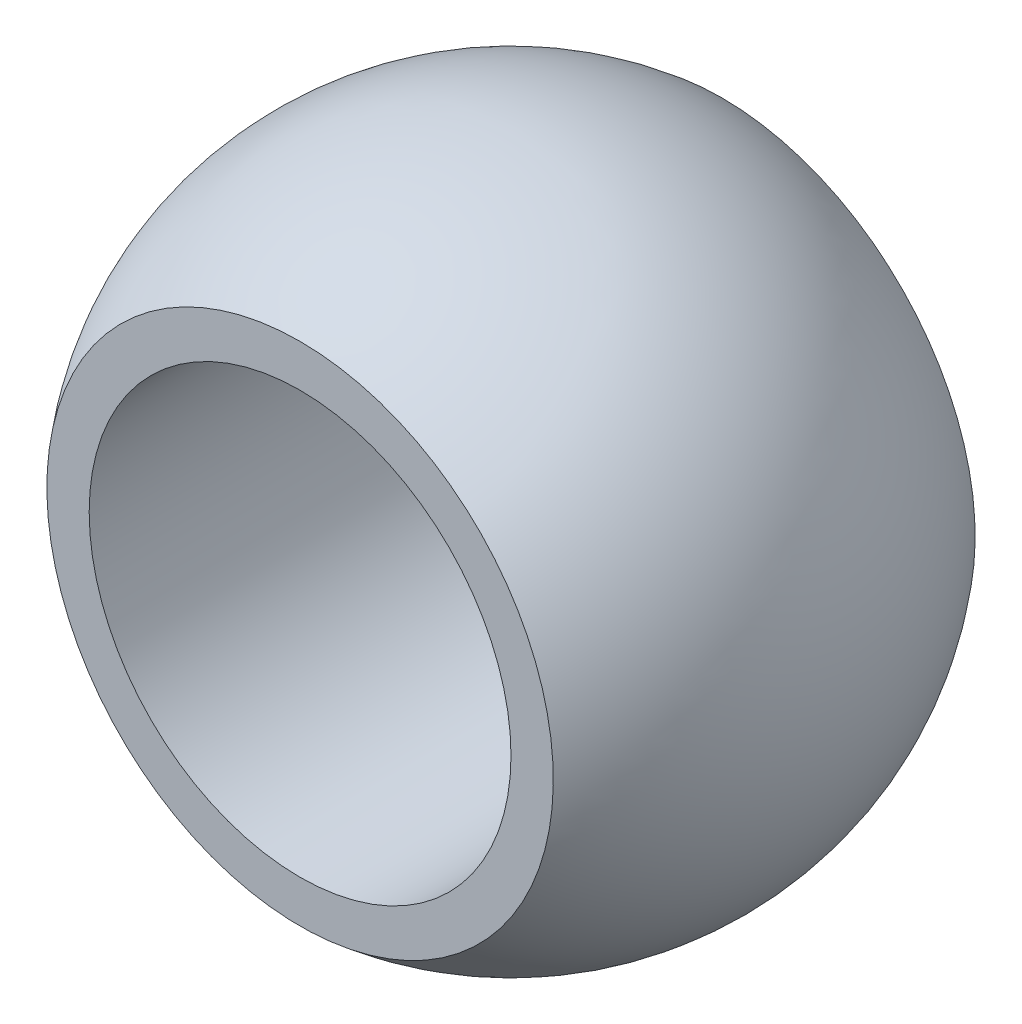
ISO-10303-21;
HEADER;
FILE_DESCRIPTION(('STEP AP214'),'2;1');
FILE_NAME('part.step','',(''),(''),'','','');
FILE_SCHEMA(('AUTOMOTIVE_DESIGN { 1 0 10303 214 1 1 1 1 }'));
ENDSEC;
DATA;
#1=APPLICATION_CONTEXT('core data for automotive mechanical design processes');
#2=APPLICATION_PROTOCOL_DEFINITION('international standard','automotive_design',2000,#1);
#3=PRODUCT_CONTEXT('',#1,'mechanical');
#4=PRODUCT('Part','Part','',(#3));
#5=PRODUCT_RELATED_PRODUCT_CATEGORY('part','',(#4));
#6=PRODUCT_DEFINITION_FORMATION('','',#4);
#7=PRODUCT_DEFINITION_CONTEXT('part definition',#1,'design');
#8=PRODUCT_DEFINITION('design','',#6,#7);
#9=PRODUCT_DEFINITION_SHAPE('','',#8);
#10=(LENGTH_UNIT() NAMED_UNIT(*) SI_UNIT(.MILLI.,.METRE.));
#11=(NAMED_UNIT(*) PLANE_ANGLE_UNIT() SI_UNIT($,.RADIAN.));
#12=(NAMED_UNIT(*) SI_UNIT($,.STERADIAN.) SOLID_ANGLE_UNIT());
#13=UNCERTAINTY_MEASURE_WITH_UNIT(LENGTH_MEASURE(1.E-05),#10,'distance_accuracy_value','');
#14=(GEOMETRIC_REPRESENTATION_CONTEXT(3) GLOBAL_UNCERTAINTY_ASSIGNED_CONTEXT((#13)) GLOBAL_UNIT_ASSIGNED_CONTEXT((#10,
#11,#12)) REPRESENTATION_CONTEXT('',''));
#15=CARTESIAN_POINT('',(0.,0.,0.));
#16=DIRECTION('',(0.,0.,1.));
#17=DIRECTION('',(1.,0.,0.));
#18=AXIS2_PLACEMENT_3D('',#15,#16,#17);
#19=CARTESIAN_POINT('',(0.,4.80234317807464,4.));
#20=DIRECTION('',(0.,0.,-1.));
#21=DIRECTION('',(-1.,0.,0.));
#22=AXIS2_PLACEMENT_3D('',#19,#20,#21);
#23=PLANE('',#22);
#24=CARTESIAN_POINT('',(0.,0.,4.));
#25=DIRECTION('',(0.,0.,1.));
#26=DIRECTION('',(1.,0.,0.));
#27=AXIS2_PLACEMENT_3D('',#24,#25,#26);
#28=CIRCLE('',#27,4.);
#29=CARTESIAN_POINT('',(4.,0.,4.));
#30=VERTEX_POINT('',#29);
#31=EDGE_CURVE('E10',#30,#30,#28,.T.);
#32=ORIENTED_EDGE('',*,*,#31,.F.);
#33=EDGE_LOOP('',(#32));
#34=FACE_BOUND('',#33,.T.);
#35=CARTESIAN_POINT('',(0.,0.,4.));
#36=DIRECTION('',(0.,0.,1.));
#37=DIRECTION('',(1.,0.,0.));
#38=AXIS2_PLACEMENT_3D('',#35,#36,#37);
#39=CIRCLE('',#38,4.80234317807464);
#40=CARTESIAN_POINT('',(0.,4.80234317807464,4.));
#41=VERTEX_POINT('',#40);
#42=EDGE_CURVE('E45',#41,#41,#39,.T.);
#43=ORIENTED_EDGE('',*,*,#42,.T.);
#44=EDGE_LOOP('',(#43));
#45=FACE_BOUND('',#44,.T.);
#46=ADVANCED_FACE('F31',(#34,#45),#23,.F.);
#47=CARTESIAN_POINT('',(0.,0.,4.));
#48=DIRECTION('',(0.,0.,1.));
#49=DIRECTION('',(1.,0.,0.));
#50=AXIS2_PLACEMENT_3D('',#47,#48,#49);
#51=CYLINDRICAL_SURFACE('',#50,4.);
#52=CARTESIAN_POINT('',(0.,0.,-4.));
#53=DIRECTION('',(0.,0.,1.));
#54=DIRECTION('',(1.,0.,0.));
#55=AXIS2_PLACEMENT_3D('',#52,#53,#54);
#56=CIRCLE('',#55,4.);
#57=CARTESIAN_POINT('',(4.,0.,-4.));
#58=VERTEX_POINT('',#57);
#59=EDGE_CURVE('E37',#58,#58,#56,.T.);
#60=ORIENTED_EDGE('',*,*,#59,.F.);
#61=EDGE_LOOP('',(#60));
#62=FACE_BOUND('',#61,.T.);
#63=ORIENTED_EDGE('',*,*,#31,.T.);
#64=EDGE_LOOP('',(#63));
#65=FACE_BOUND('',#64,.T.);
#66=ADVANCED_FACE('F60',(#62,#65),#51,.F.);
#67=CARTESIAN_POINT('',(0.,4.80234317807464,-4.));
#68=DIRECTION('',(0.,0.,1.));
#69=DIRECTION('',(1.,0.,0.));
#70=AXIS2_PLACEMENT_3D('',#67,#68,#69);
#71=PLANE('',#70);
#72=CARTESIAN_POINT('',(0.,0.,-4.));
#73=DIRECTION('',(0.,0.,1.));
#74=DIRECTION('',(1.,0.,0.));
#75=AXIS2_PLACEMENT_3D('',#72,#73,#74);
#76=CIRCLE('',#75,4.80234317807464);
#77=CARTESIAN_POINT('',(0.,4.80234317807464,-4.));
#78=VERTEX_POINT('',#77);
#79=EDGE_CURVE('E41',#78,#78,#76,.T.);
#80=ORIENTED_EDGE('',*,*,#79,.F.);
#81=EDGE_LOOP('',(#80));
#82=FACE_BOUND('',#81,.T.);
#83=ORIENTED_EDGE('',*,*,#59,.T.);
#84=EDGE_LOOP('',(#83));
#85=FACE_BOUND('',#84,.T.);
#86=ADVANCED_FACE('F55',(#82,#85),#71,.F.);
#87=CARTESIAN_POINT('',(0.,0.,0.));
#88=DIRECTION('',(0.,0.,1.));
#89=DIRECTION('',(0.,1.,0.));
#90=AXIS2_PLACEMENT_3D('',#87,#88,#89);
#91=SPHERICAL_SURFACE('',#90,6.25);
#92=CARTESIAN_POINT('',(0.,4.80234317807464,4.));
#93=CARTESIAN_POINT('',(0.,4.86021908865252,3.93051707682293));
#94=CARTESIAN_POINT('',(0.,4.9165849226692,3.85977650040231));
#95=CARTESIAN_POINT('',(0.,5.02619489369063,3.7159168357477));
#96=CARTESIAN_POINT('',(0.,5.07943903069538,3.64279774751371));
#97=CARTESIAN_POINT('',(0.,5.1827040638034,3.49431785390617));
#98=CARTESIAN_POINT('',(0.,5.23272495990667,3.4189570485326));
#99=CARTESIAN_POINT('',(0.,5.32944961496876,3.26613593884275));
#100=CARTESIAN_POINT('',(0.,5.37615337392757,3.18867563452645));
#101=CARTESIAN_POINT('',(0.,5.46615568506055,3.03180137848343));
#102=CARTESIAN_POINT('',(0.,5.50945423723472,2.9523874267567));
#103=CARTESIAN_POINT('',(0.,5.59256459300888,2.79175549389879));
#104=CARTESIAN_POINT('',(0.,5.63237639660886,2.71053751276763));
#105=CARTESIAN_POINT('',(0.,5.70843825145934,2.54645051443596));
#106=CARTESIAN_POINT('',(0.,5.74468830270983,2.46358149723546));
#107=CARTESIAN_POINT('',(0.,5.81355836682803,2.29634853650632));
#108=CARTESIAN_POINT('',(0.,5.84617837969574,2.21198459297768));
#109=CARTESIAN_POINT('',(0.,5.90772691709532,2.04192070381338));
#110=CARTESIAN_POINT('',(0.,5.93665544162718,1.95622075817773));
#111=CARTESIAN_POINT('',(0.,5.99076650700101,1.7836463062221));
#112=CARTESIAN_POINT('',(0.,6.01594904784297,1.69677179990212));
#113=CARTESIAN_POINT('',(0.,6.0625207070008,1.52201188051573));
#114=CARTESIAN_POINT('',(0.,6.08390982531665,1.43412646744932));
#115=CARTESIAN_POINT('',(0.,6.12285434666711,1.25751029288328));
#116=CARTESIAN_POINT('',(0.,6.14040974970171,1.16877953138367));
#117=CARTESIAN_POINT('',(0.,6.17165376966595,0.990639810721027));
#118=CARTESIAN_POINT('',(0.,6.18534238659558,0.901230851558007));
#119=CARTESIAN_POINT('',(0.,6.20882704777047,0.721903163927604));
#120=CARTESIAN_POINT('',(0.,6.21862309201573,0.631984435460222));
#121=CARTESIAN_POINT('',(0.,6.23430415405971,0.451806597881577));
#122=CARTESIAN_POINT('',(0.,6.24018917185844,0.361547488770314));
#123=CARTESIAN_POINT('',(0.,6.24803709482858,0.1808589197727));
#124=CARTESIAN_POINT('',(0.,6.25,0.0904294598863502));
#125=CARTESIAN_POINT('',(0.,6.25,-0.0904294598863502));
#126=CARTESIAN_POINT('',(0.,6.24803709482858,-0.1808589197727));
#127=CARTESIAN_POINT('',(0.,6.24018917185844,-0.361547488770314));
#128=CARTESIAN_POINT('',(0.,6.23430415405971,-0.451806597881577));
#129=CARTESIAN_POINT('',(0.,6.21862309201573,-0.631984435460222));
#130=CARTESIAN_POINT('',(0.,6.20882704777047,-0.721903163927604));
#131=CARTESIAN_POINT('',(0.,6.18534238659558,-0.901230851558007));
#132=CARTESIAN_POINT('',(0.,6.17165376966595,-0.990639810721027));
#133=CARTESIAN_POINT('',(0.,6.14040974970171,-1.16877953138367));
#134=CARTESIAN_POINT('',(0.,6.12285434666711,-1.25751029288328));
#135=CARTESIAN_POINT('',(0.,6.08390982531665,-1.43412646744932));
#136=CARTESIAN_POINT('',(0.,6.0625207070008,-1.52201188051573));
#137=CARTESIAN_POINT('',(0.,6.01594904784297,-1.69677179990212));
#138=CARTESIAN_POINT('',(0.,5.99076650700101,-1.7836463062221));
#139=CARTESIAN_POINT('',(0.,5.93665544162718,-1.95622075817773));
#140=CARTESIAN_POINT('',(0.,5.90772691709532,-2.04192070381338));
#141=CARTESIAN_POINT('',(0.,5.84617837969574,-2.21198459297768));
#142=CARTESIAN_POINT('',(0.,5.81355836682803,-2.29634853650632));
#143=CARTESIAN_POINT('',(0.,5.74468830270983,-2.46358149723546));
#144=CARTESIAN_POINT('',(0.,5.70843825145934,-2.54645051443596));
#145=CARTESIAN_POINT('',(0.,5.63237639660886,-2.71053751276763));
#146=CARTESIAN_POINT('',(0.,5.59256459300888,-2.79175549389879));
#147=CARTESIAN_POINT('',(0.,5.50945423723472,-2.9523874267567));
#148=CARTESIAN_POINT('',(0.,5.46615568506055,-3.03180137848343));
#149=CARTESIAN_POINT('',(0.,5.37615337392757,-3.18867563452645));
#150=CARTESIAN_POINT('',(0.,5.32944961496876,-3.26613593884275));
#151=CARTESIAN_POINT('',(0.,5.23272495990667,-3.4189570485326));
#152=CARTESIAN_POINT('',(0.,5.1827040638034,-3.49431785390617));
#153=CARTESIAN_POINT('',(0.,5.07943903069538,-3.64279774751371));
#154=CARTESIAN_POINT('',(0.,5.02619489369063,-3.7159168357477));
#155=CARTESIAN_POINT('',(0.,4.9165849226692,-3.85977650040231));
#156=CARTESIAN_POINT('',(0.,4.86021908865252,-3.93051707682293));
#157=CARTESIAN_POINT('',(0.,4.80234317807464,-4.));
#158=B_SPLINE_CURVE_WITH_KNOTS('',3,(#92,#93,#94,#95,#96,#97,#98,#99,#100,#101,#102,#103,#104,
#105,#106,#107,#108,#109,#110,#111,#112,#113,#114,#115,#116,#117,#118,#119,#120,#121,#122,#123,
#124,#125,#126,#127,#128,#129,#130,#131,#132,#133,#134,#135,#136,#137,#138,#139,#140,#141,#142,
#143,#144,#145,#146,#147,#148,#149,#150,#151,#152,#153,#154,#155,#156,#157),.UNSPECIFIED.,.F.,
.F.,(4,2,2,2,2,2,2,2,2,2,2,2,2,2,2,2,2,2,2,2,2,2,2,2,2,2,2,2,2,2,2,2,4),(0.,0.27126708832102,
0.542534176642041,0.81380126496306,1.08506835328408,1.3563354416051,1.62760252992612,
1.89886961824714,2.17013670656816,2.44140379488918,2.7126708832102,2.98393797153122,
3.25520505985224,3.52647214817326,3.79773923649428,4.0690063248153,4.34027341313632,
4.61154050145734,4.88280758977836,5.15407467809938,5.4253417664204,5.69660885474142,
5.96787594306245,6.23914303138347,6.51041011970449,6.78167720802551,7.05294429634653,
7.32421138466755,7.59547847298857,7.86674556130959,8.13801264963061,8.40927973795162,
8.68054682627264),.UNSPECIFIED.);
#159=EDGE_CURVE('BSEAM52',#41,#78,#158,.T.);
#160=ORIENTED_EDGE('',*,*,#42,.F.);
#161=ORIENTED_EDGE('',*,*,#79,.T.);
#162=ORIENTED_EDGE('',*,*,#159,.T.);
#163=ORIENTED_EDGE('',*,*,#159,.F.);
#164=EDGE_LOOP('',(#160,#162,#161,#163));
#165=FACE_BOUND('',#164,.T.);
#166=ADVANCED_FACE('F52',(#165),#91,.T.);
#167=CLOSED_SHELL('',(#46,#66,#86,#166));
#168=MANIFOLD_SOLID_BREP('B2',#167);
#169=ADVANCED_BREP_SHAPE_REPRESENTATION('',(#18,#168),#14);
#170=SHAPE_DEFINITION_REPRESENTATION(#9,#169);
ENDSEC;
END-ISO-10303-21;
